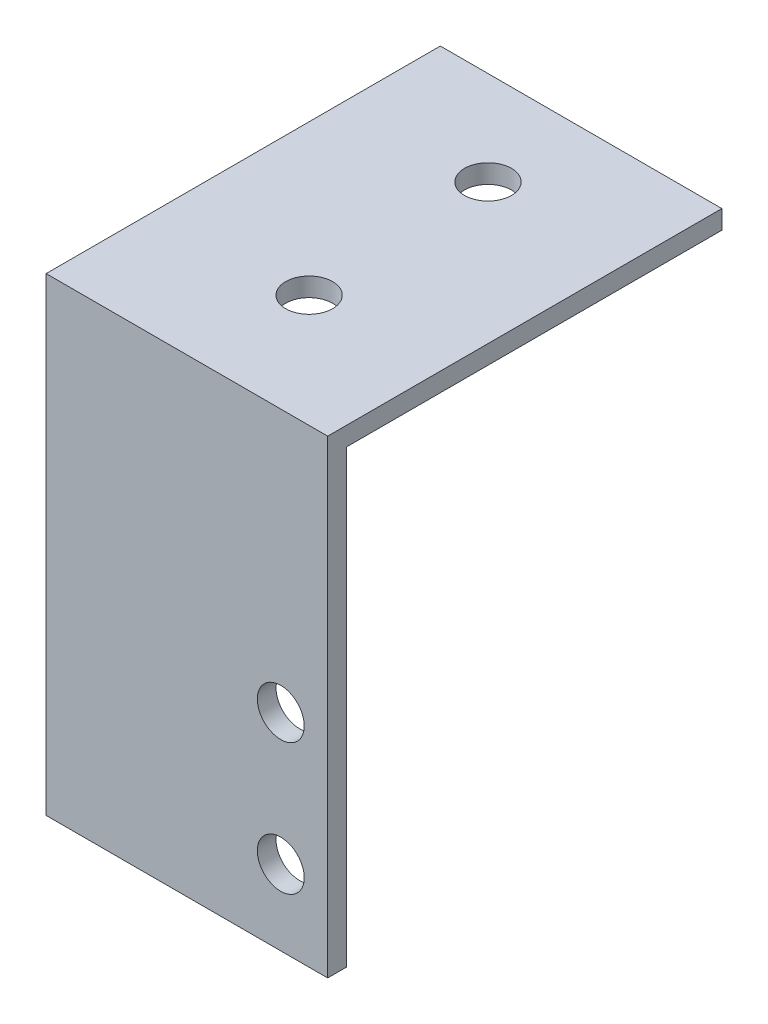
ISO-10303-21;
HEADER;
FILE_DESCRIPTION(('STEP AP214'),'2;1');
FILE_NAME('part.step','',(''),(''),'','','');
FILE_SCHEMA(('AUTOMOTIVE_DESIGN { 1 0 10303 214 1 1 1 1 }'));
ENDSEC;
DATA;
#1=APPLICATION_CONTEXT('core data for automotive mechanical design processes');
#2=APPLICATION_PROTOCOL_DEFINITION('international standard','automotive_design',2000,#1);
#3=PRODUCT_CONTEXT('',#1,'mechanical');
#4=PRODUCT('Part','Part','',(#3));
#5=PRODUCT_RELATED_PRODUCT_CATEGORY('part','',(#4));
#6=PRODUCT_DEFINITION_FORMATION('','',#4);
#7=PRODUCT_DEFINITION_CONTEXT('part definition',#1,'design');
#8=PRODUCT_DEFINITION('design','',#6,#7);
#9=PRODUCT_DEFINITION_SHAPE('','',#8);
#10=(LENGTH_UNIT() NAMED_UNIT(*) SI_UNIT(.MILLI.,.METRE.));
#11=(NAMED_UNIT(*) PLANE_ANGLE_UNIT() SI_UNIT($,.RADIAN.));
#12=(NAMED_UNIT(*) SI_UNIT($,.STERADIAN.) SOLID_ANGLE_UNIT());
#13=UNCERTAINTY_MEASURE_WITH_UNIT(LENGTH_MEASURE(1.E-05),#10,'distance_accuracy_value','');
#14=(GEOMETRIC_REPRESENTATION_CONTEXT(3) GLOBAL_UNCERTAINTY_ASSIGNED_CONTEXT((#13)) GLOBAL_UNIT_ASSIGNED_CONTEXT((#10,
#11,#12)) REPRESENTATION_CONTEXT('',''));
#15=CARTESIAN_POINT('',(0.,0.,0.));
#16=DIRECTION('',(0.,0.,1.));
#17=DIRECTION('',(1.,0.,0.));
#18=AXIS2_PLACEMENT_3D('',#15,#16,#17);
#19=CARTESIAN_POINT('',(0.,0.,1.));
#20=DIRECTION('',(-1.,0.,0.));
#21=DIRECTION('',(0.,0.,1.));
#22=AXIS2_PLACEMENT_3D('',#19,#20,#21);
#23=PLANE('',#22);
#24=DIRECTION('',(0.,1.,0.));
#25=VECTOR('',#24,1.);
#26=CARTESIAN_POINT('',(0.,0.,0.));
#27=LINE('',#26,#25);
#28=CARTESIAN_POINT('',(0.,0.,0.));
#29=VERTEX_POINT('',#28);
#30=CARTESIAN_POINT('',(0.,24.,0.));
#31=VERTEX_POINT('',#30);
#32=EDGE_CURVE('E135',#29,#31,#27,.T.);
#33=ORIENTED_EDGE('',*,*,#32,.F.);
#34=DIRECTION('',(0.,0.,-1.));
#35=VECTOR('',#34,1.);
#36=CARTESIAN_POINT('',(0.,0.,1.));
#37=LINE('',#36,#35);
#38=CARTESIAN_POINT('',(0.,0.,1.));
#39=VERTEX_POINT('',#38);
#40=EDGE_CURVE('E11',#39,#29,#37,.T.);
#41=ORIENTED_EDGE('',*,*,#40,.F.);
#42=DIRECTION('',(0.,1.,0.));
#43=VECTOR('',#42,1.);
#44=CARTESIAN_POINT('',(0.,0.,1.));
#45=LINE('',#44,#43);
#46=CARTESIAN_POINT('',(0.,25.,1.));
#47=VERTEX_POINT('',#46);
#48=EDGE_CURVE('E95',#39,#47,#45,.T.);
#49=ORIENTED_EDGE('',*,*,#48,.T.);
#50=DIRECTION('',(0.,0.,-1.));
#51=VECTOR('',#50,1.);
#52=CARTESIAN_POINT('',(0.,25.,1.));
#53=LINE('',#52,#51);
#54=CARTESIAN_POINT('',(0.,25.,-20.));
#55=VERTEX_POINT('',#54);
#56=EDGE_CURVE('E36',#47,#55,#53,.T.);
#57=ORIENTED_EDGE('',*,*,#56,.T.);
#58=DIRECTION('',(0.,1.,0.));
#59=VECTOR('',#58,1.);
#60=CARTESIAN_POINT('',(0.,25.,-20.));
#61=LINE('',#60,#59);
#62=CARTESIAN_POINT('',(0.,24.,-20.));
#63=VERTEX_POINT('',#62);
#64=EDGE_CURVE('E93',#63,#55,#61,.T.);
#65=ORIENTED_EDGE('',*,*,#64,.F.);
#66=DIRECTION('',(0.,0.,1.));
#67=VECTOR('',#66,1.);
#68=CARTESIAN_POINT('',(0.,24.,-20.));
#69=LINE('',#68,#67);
#70=EDGE_CURVE('E117',#63,#31,#69,.T.);
#71=ORIENTED_EDGE('',*,*,#70,.T.);
#72=EDGE_LOOP('',(#33,#41,#49,#57,#65,#71));
#73=FACE_BOUND('',#72,.T.);
#74=ADVANCED_FACE('F33',(#73),#23,.T.);
#75=CARTESIAN_POINT('',(0.,0.,1.));
#76=DIRECTION('',(0.,1.,0.));
#77=DIRECTION('',(0.,0.,1.));
#78=AXIS2_PLACEMENT_3D('',#75,#76,#77);
#79=PLANE('',#78);
#80=DIRECTION('',(1.,0.,0.));
#81=VECTOR('',#80,1.);
#82=CARTESIAN_POINT('',(0.,0.,0.));
#83=LINE('',#82,#81);
#84=CARTESIAN_POINT('',(15.,0.,0.));
#85=VERTEX_POINT('',#84);
#86=EDGE_CURVE('E138',#29,#85,#83,.T.);
#87=ORIENTED_EDGE('',*,*,#86,.T.);
#88=DIRECTION('',(0.,0.,-1.));
#89=VECTOR('',#88,1.);
#90=CARTESIAN_POINT('',(15.,0.,1.));
#91=LINE('',#90,#89);
#92=CARTESIAN_POINT('',(15.,0.,1.));
#93=VERTEX_POINT('',#92);
#94=EDGE_CURVE('E41',#93,#85,#91,.T.);
#95=ORIENTED_EDGE('',*,*,#94,.F.);
#96=DIRECTION('',(1.,0.,0.));
#97=VECTOR('',#96,1.);
#98=CARTESIAN_POINT('',(0.,0.,1.));
#99=LINE('',#98,#97);
#100=EDGE_CURVE('E97',#39,#93,#99,.T.);
#101=ORIENTED_EDGE('',*,*,#100,.F.);
#102=ORIENTED_EDGE('',*,*,#40,.T.);
#103=EDGE_LOOP('',(#87,#95,#101,#102));
#104=FACE_BOUND('',#103,.T.);
#105=ADVANCED_FACE('F159',(#104),#79,.F.);
#106=CARTESIAN_POINT('',(15.,0.,1.));
#107=DIRECTION('',(-1.,0.,0.));
#108=DIRECTION('',(0.,0.,1.));
#109=AXIS2_PLACEMENT_3D('',#106,#107,#108);
#110=PLANE('',#109);
#111=DIRECTION('',(0.,1.,0.));
#112=VECTOR('',#111,1.);
#113=CARTESIAN_POINT('',(15.,0.,0.));
#114=LINE('',#113,#112);
#115=CARTESIAN_POINT('',(15.,24.,0.));
#116=VERTEX_POINT('',#115);
#117=EDGE_CURVE('E144',#85,#116,#114,.T.);
#118=ORIENTED_EDGE('',*,*,#117,.T.);
#119=DIRECTION('',(0.,0.,1.));
#120=VECTOR('',#119,1.);
#121=CARTESIAN_POINT('',(15.,24.,-20.));
#122=LINE('',#121,#120);
#123=CARTESIAN_POINT('',(15.,24.,-20.));
#124=VERTEX_POINT('',#123);
#125=EDGE_CURVE('E120',#124,#116,#122,.T.);
#126=ORIENTED_EDGE('',*,*,#125,.F.);
#127=DIRECTION('',(0.,-1.,0.));
#128=VECTOR('',#127,1.);
#129=CARTESIAN_POINT('',(15.,25.,-20.));
#130=LINE('',#129,#128);
#131=CARTESIAN_POINT('',(15.,25.,-20.));
#132=VERTEX_POINT('',#131);
#133=EDGE_CURVE('E104',#132,#124,#130,.T.);
#134=ORIENTED_EDGE('',*,*,#133,.F.);
#135=DIRECTION('',(0.,0.,-1.));
#136=VECTOR('',#135,1.);
#137=CARTESIAN_POINT('',(15.,25.,1.));
#138=LINE('',#137,#136);
#139=CARTESIAN_POINT('',(15.,25.,1.));
#140=VERTEX_POINT('',#139);
#141=EDGE_CURVE('E96',#140,#132,#138,.T.);
#142=ORIENTED_EDGE('',*,*,#141,.F.);
#143=DIRECTION('',(0.,1.,0.));
#144=VECTOR('',#143,1.);
#145=CARTESIAN_POINT('',(15.,0.,1.));
#146=LINE('',#145,#144);
#147=EDGE_CURVE('E140',#93,#140,#146,.T.);
#148=ORIENTED_EDGE('',*,*,#147,.F.);
#149=ORIENTED_EDGE('',*,*,#94,.T.);
#150=EDGE_LOOP('',(#118,#126,#134,#142,#148,#149));
#151=FACE_BOUND('',#150,.T.);
#152=ADVANCED_FACE('F151',(#151),#110,.F.);
#153=CARTESIAN_POINT('',(0.,25.,1.));
#154=DIRECTION('',(0.,1.,0.));
#155=DIRECTION('',(0.,0.,1.));
#156=AXIS2_PLACEMENT_3D('',#153,#154,#155);
#157=PLANE('',#156);
#158=CARTESIAN_POINT('',(8.,25.,-5.01058518859494));
#159=DIRECTION('',(0.,1.,0.));
#160=DIRECTION('',(0.,0.,1.));
#161=AXIS2_PLACEMENT_3D('',#158,#159,#160);
#162=CIRCLE('',#161,1.24999999999999);
#163=CARTESIAN_POINT('',(8.,25.,-3.76058518859495));
#164=VERTEX_POINT('',#163);
#165=EDGE_CURVE('E178',#164,#164,#162,.T.);
#166=ORIENTED_EDGE('',*,*,#165,.F.);
#167=EDGE_LOOP('',(#166));
#168=FACE_BOUND('',#167,.T.);
#169=CARTESIAN_POINT('',(7.54000899391284,25.,-15.));
#170=DIRECTION('',(0.,1.,0.));
#171=DIRECTION('',(0.,0.,1.));
#172=AXIS2_PLACEMENT_3D('',#169,#170,#171);
#173=CIRCLE('',#172,1.24999999999999);
#174=CARTESIAN_POINT('',(7.54000899391284,25.,-13.75));
#175=VERTEX_POINT('',#174);
#176=EDGE_CURVE('E111',#175,#175,#173,.T.);
#177=ORIENTED_EDGE('',*,*,#176,.F.);
#178=EDGE_LOOP('',(#177));
#179=FACE_BOUND('',#178,.T.);
#180=ORIENTED_EDGE('',*,*,#141,.T.);
#181=DIRECTION('',(1.,0.,0.));
#182=VECTOR('',#181,1.);
#183=CARTESIAN_POINT('',(0.,25.,-20.));
#184=LINE('',#183,#182);
#185=EDGE_CURVE('E99',#55,#132,#184,.T.);
#186=ORIENTED_EDGE('',*,*,#185,.F.);
#187=ORIENTED_EDGE('',*,*,#56,.F.);
#188=DIRECTION('',(1.,0.,0.));
#189=VECTOR('',#188,1.);
#190=CARTESIAN_POINT('',(0.,25.,1.));
#191=LINE('',#190,#189);
#192=EDGE_CURVE('E137',#47,#140,#191,.T.);
#193=ORIENTED_EDGE('',*,*,#192,.T.);
#194=EDGE_LOOP('',(#180,#186,#187,#193));
#195=FACE_BOUND('',#194,.T.);
#196=ADVANCED_FACE('F100',(#168,#179,#195),#157,.T.);
#197=CARTESIAN_POINT('',(0.,0.,1.));
#198=DIRECTION('',(0.,0.,-1.));
#199=DIRECTION('',(-1.,0.,0.));
#200=AXIS2_PLACEMENT_3D('',#197,#198,#199);
#201=PLANE('',#200);
#202=CARTESIAN_POINT('',(12.5,11.,1.));
#203=DIRECTION('',(0.,0.,-1.));
#204=DIRECTION('',(-1.,0.,0.));
#205=AXIS2_PLACEMENT_3D('',#202,#203,#204);
#206=CIRCLE('',#205,1.24999999999999);
#207=CARTESIAN_POINT('',(11.25,11.,1.));
#208=VERTEX_POINT('',#207);
#209=EDGE_CURVE('E126',#208,#208,#206,.T.);
#210=ORIENTED_EDGE('',*,*,#209,.T.);
#211=EDGE_LOOP('',(#210));
#212=FACE_BOUND('',#211,.T.);
#213=CARTESIAN_POINT('',(12.5,4.,1.));
#214=DIRECTION('',(0.,0.,-1.));
#215=DIRECTION('',(-1.,0.,0.));
#216=AXIS2_PLACEMENT_3D('',#213,#214,#215);
#217=CIRCLE('',#216,1.24999999999999);
#218=CARTESIAN_POINT('',(11.25,4.,1.));
#219=VERTEX_POINT('',#218);
#220=EDGE_CURVE('E132',#219,#219,#217,.T.);
#221=ORIENTED_EDGE('',*,*,#220,.T.);
#222=EDGE_LOOP('',(#221));
#223=FACE_BOUND('',#222,.T.);
#224=ORIENTED_EDGE('',*,*,#48,.F.);
#225=ORIENTED_EDGE('',*,*,#100,.T.);
#226=ORIENTED_EDGE('',*,*,#147,.T.);
#227=ORIENTED_EDGE('',*,*,#192,.F.);
#228=EDGE_LOOP('',(#224,#225,#226,#227));
#229=FACE_BOUND('',#228,.T.);
#230=ADVANCED_FACE('F158',(#212,#223,#229),#201,.F.);
#231=CARTESIAN_POINT('',(0.,0.,0.));
#232=DIRECTION('',(0.,0.,-1.));
#233=DIRECTION('',(-1.,0.,0.));
#234=AXIS2_PLACEMENT_3D('',#231,#232,#233);
#235=PLANE('',#234);
#236=DIRECTION('',(-1.,0.,0.));
#237=VECTOR('',#236,1.);
#238=CARTESIAN_POINT('',(0.,24.,0.));
#239=LINE('',#238,#237);
#240=EDGE_CURVE('E49',#116,#31,#239,.T.);
#241=ORIENTED_EDGE('',*,*,#240,.F.);
#242=ORIENTED_EDGE('',*,*,#117,.F.);
#243=ORIENTED_EDGE('',*,*,#86,.F.);
#244=ORIENTED_EDGE('',*,*,#32,.T.);
#245=EDGE_LOOP('',(#241,#242,#243,#244));
#246=FACE_BOUND('',#245,.T.);
#247=CARTESIAN_POINT('',(12.5,11.,0.));
#248=DIRECTION('',(0.,0.,-1.));
#249=DIRECTION('',(-1.,0.,0.));
#250=AXIS2_PLACEMENT_3D('',#247,#248,#249);
#251=CIRCLE('',#250,1.24999999999999);
#252=CARTESIAN_POINT('',(11.25,11.,0.));
#253=VERTEX_POINT('',#252);
#254=EDGE_CURVE('E123',#253,#253,#251,.T.);
#255=ORIENTED_EDGE('',*,*,#254,.F.);
#256=EDGE_LOOP('',(#255));
#257=FACE_BOUND('',#256,.T.);
#258=CARTESIAN_POINT('',(12.5,4.,0.));
#259=DIRECTION('',(0.,0.,-1.));
#260=DIRECTION('',(-1.,0.,0.));
#261=AXIS2_PLACEMENT_3D('',#258,#259,#260);
#262=CIRCLE('',#261,1.24999999999999);
#263=CARTESIAN_POINT('',(11.25,4.,0.));
#264=VERTEX_POINT('',#263);
#265=EDGE_CURVE('E129',#264,#264,#262,.T.);
#266=ORIENTED_EDGE('',*,*,#265,.F.);
#267=EDGE_LOOP('',(#266));
#268=FACE_BOUND('',#267,.T.);
#269=ADVANCED_FACE('F153',(#246,#257,#268),#235,.T.);
#270=CARTESIAN_POINT('',(12.5,4.,0.));
#271=DIRECTION('',(0.,0.,-1.));
#272=DIRECTION('',(-1.,0.,0.));
#273=AXIS2_PLACEMENT_3D('',#270,#271,#272);
#274=CYLINDRICAL_SURFACE('',#273,1.24999999999999);
#275=ORIENTED_EDGE('',*,*,#265,.T.);
#276=EDGE_LOOP('',(#275));
#277=FACE_BOUND('',#276,.T.);
#278=ORIENTED_EDGE('',*,*,#220,.F.);
#279=EDGE_LOOP('',(#278));
#280=FACE_BOUND('',#279,.T.);
#281=ADVANCED_FACE('F204',(#277,#280),#274,.F.);
#282=CARTESIAN_POINT('',(12.5,11.,0.));
#283=DIRECTION('',(0.,0.,-1.));
#284=DIRECTION('',(-1.,0.,0.));
#285=AXIS2_PLACEMENT_3D('',#282,#283,#284);
#286=CYLINDRICAL_SURFACE('',#285,1.24999999999999);
#287=ORIENTED_EDGE('',*,*,#254,.T.);
#288=EDGE_LOOP('',(#287));
#289=FACE_BOUND('',#288,.T.);
#290=ORIENTED_EDGE('',*,*,#209,.F.);
#291=EDGE_LOOP('',(#290));
#292=FACE_BOUND('',#291,.T.);
#293=ADVANCED_FACE('F196',(#289,#292),#286,.F.);
#294=CARTESIAN_POINT('',(0.,24.,-20.));
#295=DIRECTION('',(0.,1.,0.));
#296=DIRECTION('',(-1.,0.,0.));
#297=AXIS2_PLACEMENT_3D('',#294,#295,#296);
#298=PLANE('',#297);
#299=CARTESIAN_POINT('',(8.,24.,-5.01058518859494));
#300=DIRECTION('',(0.,-1.,0.));
#301=DIRECTION('',(0.,0.,-1.));
#302=AXIS2_PLACEMENT_3D('',#299,#300,#301);
#303=CIRCLE('',#302,1.24999999999999);
#304=CARTESIAN_POINT('',(8.,24.,-6.26058518859493));
#305=VERTEX_POINT('',#304);
#306=EDGE_CURVE('E186',#305,#305,#303,.T.);
#307=ORIENTED_EDGE('',*,*,#306,.F.);
#308=EDGE_LOOP('',(#307));
#309=FACE_BOUND('',#308,.T.);
#310=CARTESIAN_POINT('',(7.54000899391284,24.,-15.));
#311=DIRECTION('',(0.,-1.,0.));
#312=DIRECTION('',(0.,0.,-1.));
#313=AXIS2_PLACEMENT_3D('',#310,#311,#312);
#314=CIRCLE('',#313,1.24999999999999);
#315=CARTESIAN_POINT('',(7.54000899391284,24.,-16.25));
#316=VERTEX_POINT('',#315);
#317=EDGE_CURVE('E182',#316,#316,#314,.T.);
#318=ORIENTED_EDGE('',*,*,#317,.F.);
#319=EDGE_LOOP('',(#318));
#320=FACE_BOUND('',#319,.T.);
#321=ORIENTED_EDGE('',*,*,#240,.T.);
#322=ORIENTED_EDGE('',*,*,#70,.F.);
#323=DIRECTION('',(-1.,0.,0.));
#324=VECTOR('',#323,1.);
#325=CARTESIAN_POINT('',(0.,24.,-20.));
#326=LINE('',#325,#324);
#327=EDGE_CURVE('E108',#124,#63,#326,.T.);
#328=ORIENTED_EDGE('',*,*,#327,.F.);
#329=ORIENTED_EDGE('',*,*,#125,.T.);
#330=EDGE_LOOP('',(#321,#322,#328,#329));
#331=FACE_BOUND('',#330,.T.);
#332=ADVANCED_FACE('F156',(#309,#320,#331),#298,.F.);
#333=CARTESIAN_POINT('',(0.,0.,-20.));
#334=DIRECTION('',(0.,0.,1.));
#335=DIRECTION('',(1.,0.,0.));
#336=AXIS2_PLACEMENT_3D('',#333,#334,#335);
#337=PLANE('',#336);
#338=ORIENTED_EDGE('',*,*,#64,.T.);
#339=ORIENTED_EDGE('',*,*,#185,.T.);
#340=ORIENTED_EDGE('',*,*,#133,.T.);
#341=ORIENTED_EDGE('',*,*,#327,.T.);
#342=EDGE_LOOP('',(#338,#339,#340,#341));
#343=FACE_BOUND('',#342,.T.);
#344=ADVANCED_FACE('F106',(#343),#337,.F.);
#345=CARTESIAN_POINT('',(7.54000899391284,24.,-15.));
#346=DIRECTION('',(0.,-1.,0.));
#347=DIRECTION('',(0.,0.,-1.));
#348=AXIS2_PLACEMENT_3D('',#345,#346,#347);
#349=CYLINDRICAL_SURFACE('',#348,1.24999999999999);
#350=ORIENTED_EDGE('',*,*,#176,.T.);
#351=EDGE_LOOP('',(#350));
#352=FACE_BOUND('',#351,.T.);
#353=ORIENTED_EDGE('',*,*,#317,.T.);
#354=EDGE_LOOP('',(#353));
#355=FACE_BOUND('',#354,.T.);
#356=ADVANCED_FACE('F202',(#352,#355),#349,.F.);
#357=CARTESIAN_POINT('',(8.,24.,-5.01058518859494));
#358=DIRECTION('',(0.,-1.,0.));
#359=DIRECTION('',(0.,0.,-1.));
#360=AXIS2_PLACEMENT_3D('',#357,#358,#359);
#361=CYLINDRICAL_SURFACE('',#360,1.24999999999999);
#362=ORIENTED_EDGE('',*,*,#165,.T.);
#363=EDGE_LOOP('',(#362));
#364=FACE_BOUND('',#363,.T.);
#365=ORIENTED_EDGE('',*,*,#306,.T.);
#366=EDGE_LOOP('',(#365));
#367=FACE_BOUND('',#366,.T.);
#368=ADVANCED_FACE('F192',(#364,#367),#361,.F.);
#369=CLOSED_SHELL('',(#74,#105,#152,#196,#230,#269,#281,#293,#332,#344,#356,#368));
#370=MANIFOLD_SOLID_BREP('B2',#369);
#371=ADVANCED_BREP_SHAPE_REPRESENTATION('',(#18,#370),#14);
#372=SHAPE_DEFINITION_REPRESENTATION(#9,#371);
ENDSEC;
END-ISO-10303-21;
